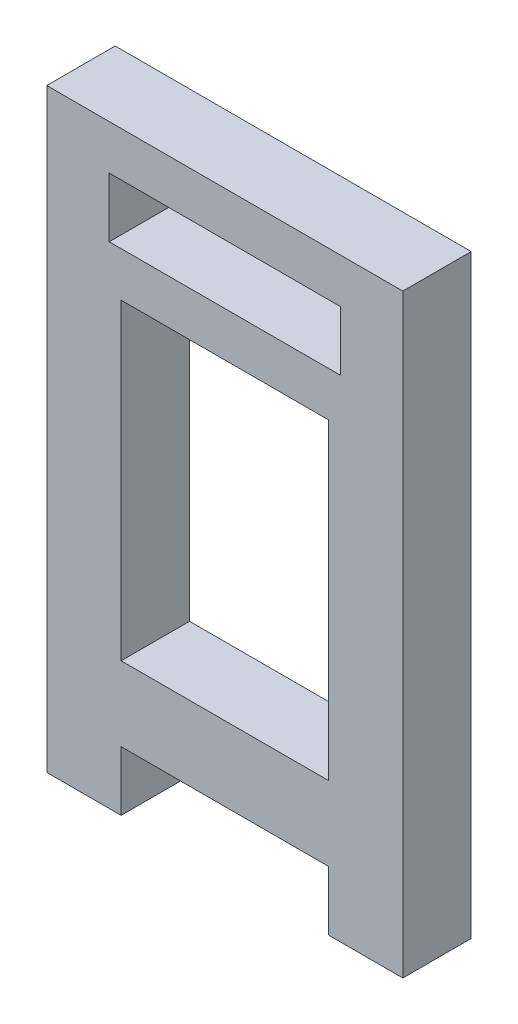
ISO-10303-21;
HEADER;
FILE_DESCRIPTION(('STEP AP214'),'2;1');
FILE_NAME('part.step','',(''),(''),'','','');
FILE_SCHEMA(('AUTOMOTIVE_DESIGN { 1 0 10303 214 1 1 1 1 }'));
ENDSEC;
DATA;
#1=APPLICATION_CONTEXT('core data for automotive mechanical design processes');
#2=APPLICATION_PROTOCOL_DEFINITION('international standard','automotive_design',2000,#1);
#3=PRODUCT_CONTEXT('',#1,'mechanical');
#4=PRODUCT('Part','Part','',(#3));
#5=PRODUCT_RELATED_PRODUCT_CATEGORY('part','',(#4));
#6=PRODUCT_DEFINITION_FORMATION('','',#4);
#7=PRODUCT_DEFINITION_CONTEXT('part definition',#1,'design');
#8=PRODUCT_DEFINITION('design','',#6,#7);
#9=PRODUCT_DEFINITION_SHAPE('','',#8);
#10=(LENGTH_UNIT() NAMED_UNIT(*) SI_UNIT(.MILLI.,.METRE.));
#11=(NAMED_UNIT(*) PLANE_ANGLE_UNIT() SI_UNIT($,.RADIAN.));
#12=(NAMED_UNIT(*) SI_UNIT($,.STERADIAN.) SOLID_ANGLE_UNIT());
#13=UNCERTAINTY_MEASURE_WITH_UNIT(LENGTH_MEASURE(1.E-05),#10,'distance_accuracy_value','');
#14=(GEOMETRIC_REPRESENTATION_CONTEXT(3) GLOBAL_UNCERTAINTY_ASSIGNED_CONTEXT((#13)) GLOBAL_UNIT_ASSIGNED_CONTEXT((#10,
#11,#12)) REPRESENTATION_CONTEXT('',''));
#15=CARTESIAN_POINT('',(0.,0.,0.));
#16=DIRECTION('',(0.,0.,1.));
#17=DIRECTION('',(1.,0.,0.));
#18=AXIS2_PLACEMENT_3D('',#15,#16,#17);
#19=CARTESIAN_POINT('',(0.,0.,2.3));
#20=DIRECTION('',(0.,0.,-1.));
#21=DIRECTION('',(-1.,0.,0.));
#22=AXIS2_PLACEMENT_3D('',#19,#20,#21);
#23=PLANE('',#22);
#24=DIRECTION('',(0.,1.,0.));
#25=VECTOR('',#24,1.);
#26=CARTESIAN_POINT('',(9.47,2.5,2.3));
#27=LINE('',#26,#25);
#28=CARTESIAN_POINT('',(9.47,2.5,2.3));
#29=VERTEX_POINT('',#28);
#30=CARTESIAN_POINT('',(9.47,13.,2.3));
#31=VERTEX_POINT('',#30);
#32=EDGE_CURVE('E188',#29,#31,#27,.T.);
#33=ORIENTED_EDGE('',*,*,#32,.F.);
#34=DIRECTION('',(1.,0.,0.));
#35=VECTOR('',#34,1.);
#36=CARTESIAN_POINT('',(2.5,2.5,2.3));
#37=LINE('',#36,#35);
#38=CARTESIAN_POINT('',(2.5,2.5,2.3));
#39=VERTEX_POINT('',#38);
#40=EDGE_CURVE('E196',#39,#29,#37,.T.);
#41=ORIENTED_EDGE('',*,*,#40,.F.);
#42=DIRECTION('',(0.,-1.,0.));
#43=VECTOR('',#42,1.);
#44=CARTESIAN_POINT('',(2.5,2.5,2.3));
#45=LINE('',#44,#43);
#46=CARTESIAN_POINT('',(2.5,13.,2.3));
#47=VERTEX_POINT('',#46);
#48=EDGE_CURVE('E193',#47,#39,#45,.T.);
#49=ORIENTED_EDGE('',*,*,#48,.F.);
#50=DIRECTION('',(-1.,0.,0.));
#51=VECTOR('',#50,1.);
#52=CARTESIAN_POINT('',(2.5,13.,2.3));
#53=LINE('',#52,#51);
#54=EDGE_CURVE('E190',#31,#47,#53,.T.);
#55=ORIENTED_EDGE('',*,*,#54,.F.);
#56=EDGE_LOOP('',(#33,#41,#49,#55));
#57=FACE_BOUND('',#56,.T.);
#58=DIRECTION('',(0.,-1.,0.));
#59=VECTOR('',#58,1.);
#60=CARTESIAN_POINT('',(0.,0.,2.3));
#61=LINE('',#60,#59);
#62=CARTESIAN_POINT('',(0.,18.,2.3));
#63=VERTEX_POINT('',#62);
#64=CARTESIAN_POINT('',(0.,-2.,2.3));
#65=VERTEX_POINT('',#64);
#66=EDGE_CURVE('E219',#63,#65,#61,.T.);
#67=ORIENTED_EDGE('',*,*,#66,.T.);
#68=DIRECTION('',(1.,0.,0.));
#69=VECTOR('',#68,1.);
#70=CARTESIAN_POINT('',(0.,-2.,2.3));
#71=LINE('',#70,#69);
#72=CARTESIAN_POINT('',(2.5,-2.,2.3));
#73=VERTEX_POINT('',#72);
#74=EDGE_CURVE('E221',#65,#73,#71,.T.);
#75=ORIENTED_EDGE('',*,*,#74,.T.);
#76=DIRECTION('',(0.,1.,0.));
#77=VECTOR('',#76,1.);
#78=CARTESIAN_POINT('',(2.5,-2.,2.3));
#79=LINE('',#78,#77);
#80=CARTESIAN_POINT('',(2.5,0.,2.3));
#81=VERTEX_POINT('',#80);
#82=EDGE_CURVE('E224',#73,#81,#79,.T.);
#83=ORIENTED_EDGE('',*,*,#82,.T.);
#84=DIRECTION('',(1.,0.,0.));
#85=VECTOR('',#84,1.);
#86=CARTESIAN_POINT('',(2.5,0.,2.3));
#87=LINE('',#86,#85);
#88=CARTESIAN_POINT('',(9.47,0.,2.3));
#89=VERTEX_POINT('',#88);
#90=EDGE_CURVE('E226',#81,#89,#87,.T.);
#91=ORIENTED_EDGE('',*,*,#90,.T.);
#92=DIRECTION('',(0.,-1.,0.));
#93=VECTOR('',#92,1.);
#94=CARTESIAN_POINT('',(9.47,-2.,2.3));
#95=LINE('',#94,#93);
#96=CARTESIAN_POINT('',(9.47,-2.,2.3));
#97=VERTEX_POINT('',#96);
#98=EDGE_CURVE('E228',#89,#97,#95,.T.);
#99=ORIENTED_EDGE('',*,*,#98,.T.);
#100=DIRECTION('',(1.,0.,0.));
#101=VECTOR('',#100,1.);
#102=CARTESIAN_POINT('',(11.97,-2.,2.3));
#103=LINE('',#102,#101);
#104=CARTESIAN_POINT('',(11.97,-2.,2.3));
#105=VERTEX_POINT('',#104);
#106=EDGE_CURVE('E230',#97,#105,#103,.T.);
#107=ORIENTED_EDGE('',*,*,#106,.T.);
#108=DIRECTION('',(0.,1.,0.));
#109=VECTOR('',#108,1.);
#110=CARTESIAN_POINT('',(11.97,0.,2.3));
#111=LINE('',#110,#109);
#112=CARTESIAN_POINT('',(11.97,18.,2.3));
#113=VERTEX_POINT('',#112);
#114=EDGE_CURVE('E232',#105,#113,#111,.T.);
#115=ORIENTED_EDGE('',*,*,#114,.T.);
#116=DIRECTION('',(-1.,0.,0.));
#117=VECTOR('',#116,1.);
#118=CARTESIAN_POINT('',(0.,18.,2.3));
#119=LINE('',#118,#117);
#120=EDGE_CURVE('E234',#113,#63,#119,.T.);
#121=ORIENTED_EDGE('',*,*,#120,.T.);
#122=EDGE_LOOP('',(#67,#75,#83,#91,#99,#107,#115,#121));
#123=FACE_BOUND('',#122,.T.);
#124=DIRECTION('',(0.,-1.,0.));
#125=VECTOR('',#124,1.);
#126=CARTESIAN_POINT('',(2.1,14.5,2.3));
#127=LINE('',#126,#125);
#128=CARTESIAN_POINT('',(2.1,16.5,2.3));
#129=VERTEX_POINT('',#128);
#130=CARTESIAN_POINT('',(2.1,14.5,2.3));
#131=VERTEX_POINT('',#130);
#132=EDGE_CURVE('E152',#129,#131,#127,.T.);
#133=ORIENTED_EDGE('',*,*,#132,.F.);
#134=DIRECTION('',(-1.,0.,0.));
#135=VECTOR('',#134,1.);
#136=CARTESIAN_POINT('',(2.1,16.5,2.3));
#137=LINE('',#136,#135);
#138=CARTESIAN_POINT('',(9.87,16.5,2.3));
#139=VERTEX_POINT('',#138);
#140=EDGE_CURVE('E174',#139,#129,#137,.T.);
#141=ORIENTED_EDGE('',*,*,#140,.F.);
#142=DIRECTION('',(0.,1.,0.));
#143=VECTOR('',#142,1.);
#144=CARTESIAN_POINT('',(9.87,14.5,2.3));
#145=LINE('',#144,#143);
#146=CARTESIAN_POINT('',(9.87,14.5,2.3));
#147=VERTEX_POINT('',#146);
#148=EDGE_CURVE('E172',#147,#139,#145,.T.);
#149=ORIENTED_EDGE('',*,*,#148,.F.);
#150=DIRECTION('',(1.,0.,0.));
#151=VECTOR('',#150,1.);
#152=CARTESIAN_POINT('',(2.1,14.5,2.3));
#153=LINE('',#152,#151);
#154=EDGE_CURVE('E160',#131,#147,#153,.T.);
#155=ORIENTED_EDGE('',*,*,#154,.F.);
#156=EDGE_LOOP('',(#133,#141,#149,#155));
#157=FACE_BOUND('',#156,.T.);
#158=ADVANCED_FACE('F39',(#57,#123,#157),#23,.F.);
#159=CARTESIAN_POINT('',(0.,0.,0.));
#160=DIRECTION('',(0.,0.,-1.));
#161=DIRECTION('',(-1.,0.,0.));
#162=AXIS2_PLACEMENT_3D('',#159,#160,#161);
#163=PLANE('',#162);
#164=DIRECTION('',(0.,-1.,0.));
#165=VECTOR('',#164,1.);
#166=CARTESIAN_POINT('',(0.,0.,0.));
#167=LINE('',#166,#165);
#168=CARTESIAN_POINT('',(0.,18.,0.));
#169=VERTEX_POINT('',#168);
#170=CARTESIAN_POINT('',(0.,-2.,0.));
#171=VERTEX_POINT('',#170);
#172=EDGE_CURVE('E218',#169,#171,#167,.T.);
#173=ORIENTED_EDGE('',*,*,#172,.F.);
#174=DIRECTION('',(-1.,0.,0.));
#175=VECTOR('',#174,1.);
#176=CARTESIAN_POINT('',(0.,18.,0.));
#177=LINE('',#176,#175);
#178=CARTESIAN_POINT('',(11.97,18.,0.));
#179=VERTEX_POINT('',#178);
#180=EDGE_CURVE('E222',#179,#169,#177,.T.);
#181=ORIENTED_EDGE('',*,*,#180,.F.);
#182=DIRECTION('',(0.,1.,0.));
#183=VECTOR('',#182,1.);
#184=CARTESIAN_POINT('',(11.97,0.,0.));
#185=LINE('',#184,#183);
#186=CARTESIAN_POINT('',(11.97,-2.,0.));
#187=VERTEX_POINT('',#186);
#188=EDGE_CURVE('E249',#187,#179,#185,.T.);
#189=ORIENTED_EDGE('',*,*,#188,.F.);
#190=DIRECTION('',(1.,0.,0.));
#191=VECTOR('',#190,1.);
#192=CARTESIAN_POINT('',(11.97,-2.,0.));
#193=LINE('',#192,#191);
#194=CARTESIAN_POINT('',(9.47,-2.,0.));
#195=VERTEX_POINT('',#194);
#196=EDGE_CURVE('E246',#195,#187,#193,.T.);
#197=ORIENTED_EDGE('',*,*,#196,.F.);
#198=DIRECTION('',(0.,-1.,0.));
#199=VECTOR('',#198,1.);
#200=CARTESIAN_POINT('',(9.47,-2.,0.));
#201=LINE('',#200,#199);
#202=CARTESIAN_POINT('',(9.47,0.,0.));
#203=VERTEX_POINT('',#202);
#204=EDGE_CURVE('E244',#203,#195,#201,.T.);
#205=ORIENTED_EDGE('',*,*,#204,.F.);
#206=DIRECTION('',(1.,0.,0.));
#207=VECTOR('',#206,1.);
#208=CARTESIAN_POINT('',(2.5,0.,0.));
#209=LINE('',#208,#207);
#210=CARTESIAN_POINT('',(2.5,0.,0.));
#211=VERTEX_POINT('',#210);
#212=EDGE_CURVE('E242',#211,#203,#209,.T.);
#213=ORIENTED_EDGE('',*,*,#212,.F.);
#214=DIRECTION('',(0.,1.,0.));
#215=VECTOR('',#214,1.);
#216=CARTESIAN_POINT('',(2.5,-2.,0.));
#217=LINE('',#216,#215);
#218=CARTESIAN_POINT('',(2.5,-2.,0.));
#219=VERTEX_POINT('',#218);
#220=EDGE_CURVE('E240',#219,#211,#217,.T.);
#221=ORIENTED_EDGE('',*,*,#220,.F.);
#222=DIRECTION('',(1.,0.,0.));
#223=VECTOR('',#222,1.);
#224=CARTESIAN_POINT('',(0.,-2.,0.));
#225=LINE('',#224,#223);
#226=EDGE_CURVE('E238',#171,#219,#225,.T.);
#227=ORIENTED_EDGE('',*,*,#226,.F.);
#228=EDGE_LOOP('',(#173,#181,#189,#197,#205,#213,#221,#227));
#229=FACE_BOUND('',#228,.T.);
#230=DIRECTION('',(1.,0.,0.));
#231=VECTOR('',#230,1.);
#232=CARTESIAN_POINT('',(2.5,2.5,0.));
#233=LINE('',#232,#231);
#234=CARTESIAN_POINT('',(2.5,2.5,0.));
#235=VERTEX_POINT('',#234);
#236=CARTESIAN_POINT('',(9.47,2.5,0.));
#237=VERTEX_POINT('',#236);
#238=EDGE_CURVE('E191',#235,#237,#233,.T.);
#239=ORIENTED_EDGE('',*,*,#238,.T.);
#240=DIRECTION('',(0.,1.,0.));
#241=VECTOR('',#240,1.);
#242=CARTESIAN_POINT('',(9.47,2.5,0.));
#243=LINE('',#242,#241);
#244=CARTESIAN_POINT('',(9.47,13.,0.));
#245=VERTEX_POINT('',#244);
#246=EDGE_CURVE('E168',#237,#245,#243,.T.);
#247=ORIENTED_EDGE('',*,*,#246,.T.);
#248=DIRECTION('',(-1.,0.,0.));
#249=VECTOR('',#248,1.);
#250=CARTESIAN_POINT('',(2.5,13.,0.));
#251=LINE('',#250,#249);
#252=CARTESIAN_POINT('',(2.5,13.,0.));
#253=VERTEX_POINT('',#252);
#254=EDGE_CURVE('E201',#245,#253,#251,.T.);
#255=ORIENTED_EDGE('',*,*,#254,.T.);
#256=DIRECTION('',(0.,-1.,0.));
#257=VECTOR('',#256,1.);
#258=CARTESIAN_POINT('',(2.5,2.5,0.));
#259=LINE('',#258,#257);
#260=EDGE_CURVE('E204',#253,#235,#259,.T.);
#261=ORIENTED_EDGE('',*,*,#260,.T.);
#262=EDGE_LOOP('',(#239,#247,#255,#261));
#263=FACE_BOUND('',#262,.T.);
#264=DIRECTION('',(-1.,0.,0.));
#265=VECTOR('',#264,1.);
#266=CARTESIAN_POINT('',(2.1,16.5,0.));
#267=LINE('',#266,#265);
#268=CARTESIAN_POINT('',(9.87,16.5,0.));
#269=VERTEX_POINT('',#268);
#270=CARTESIAN_POINT('',(2.1,16.5,0.));
#271=VERTEX_POINT('',#270);
#272=EDGE_CURVE('E161',#269,#271,#267,.T.);
#273=ORIENTED_EDGE('',*,*,#272,.T.);
#274=DIRECTION('',(0.,-1.,0.));
#275=VECTOR('',#274,1.);
#276=CARTESIAN_POINT('',(2.1,14.5,0.));
#277=LINE('',#276,#275);
#278=CARTESIAN_POINT('',(2.1,14.5,0.));
#279=VERTEX_POINT('',#278);
#280=EDGE_CURVE('E62',#271,#279,#277,.T.);
#281=ORIENTED_EDGE('',*,*,#280,.T.);
#282=DIRECTION('',(1.,0.,0.));
#283=VECTOR('',#282,1.);
#284=CARTESIAN_POINT('',(2.1,14.5,0.));
#285=LINE('',#284,#283);
#286=CARTESIAN_POINT('',(9.87,14.5,0.));
#287=VERTEX_POINT('',#286);
#288=EDGE_CURVE('E167',#279,#287,#285,.T.);
#289=ORIENTED_EDGE('',*,*,#288,.T.);
#290=DIRECTION('',(0.,1.,0.));
#291=VECTOR('',#290,1.);
#292=CARTESIAN_POINT('',(9.87,14.5,0.));
#293=LINE('',#292,#291);
#294=EDGE_CURVE('E180',#287,#269,#293,.T.);
#295=ORIENTED_EDGE('',*,*,#294,.T.);
#296=EDGE_LOOP('',(#273,#281,#289,#295));
#297=FACE_BOUND('',#296,.T.);
#298=ADVANCED_FACE('F281',(#229,#263,#297),#163,.T.);
#299=CARTESIAN_POINT('',(0.,0.,2.3));
#300=DIRECTION('',(1.,0.,0.));
#301=DIRECTION('',(0.,1.,0.));
#302=AXIS2_PLACEMENT_3D('',#299,#300,#301);
#303=PLANE('',#302);
#304=ORIENTED_EDGE('',*,*,#172,.T.);
#305=DIRECTION('',(0.,0.,-1.));
#306=VECTOR('',#305,1.);
#307=CARTESIAN_POINT('',(0.,-2.,2.3));
#308=LINE('',#307,#306);
#309=EDGE_CURVE('E11',#65,#171,#308,.T.);
#310=ORIENTED_EDGE('',*,*,#309,.F.);
#311=ORIENTED_EDGE('',*,*,#66,.F.);
#312=DIRECTION('',(0.,0.,-1.));
#313=VECTOR('',#312,1.);
#314=CARTESIAN_POINT('',(0.,18.,2.3));
#315=LINE('',#314,#313);
#316=EDGE_CURVE('E236',#63,#169,#315,.T.);
#317=ORIENTED_EDGE('',*,*,#316,.T.);
#318=EDGE_LOOP('',(#304,#310,#311,#317));
#319=FACE_BOUND('',#318,.T.);
#320=ADVANCED_FACE('F41',(#319),#303,.F.);
#321=CARTESIAN_POINT('',(0.,-2.,2.3));
#322=DIRECTION('',(0.,1.,0.));
#323=DIRECTION('',(0.,0.,1.));
#324=AXIS2_PLACEMENT_3D('',#321,#322,#323);
#325=PLANE('',#324);
#326=ORIENTED_EDGE('',*,*,#226,.T.);
#327=DIRECTION('',(0.,0.,-1.));
#328=VECTOR('',#327,1.);
#329=CARTESIAN_POINT('',(2.5,-2.,2.3));
#330=LINE('',#329,#328);
#331=EDGE_CURVE('E47',#73,#219,#330,.T.);
#332=ORIENTED_EDGE('',*,*,#331,.F.);
#333=ORIENTED_EDGE('',*,*,#74,.F.);
#334=ORIENTED_EDGE('',*,*,#309,.T.);
#335=EDGE_LOOP('',(#326,#332,#333,#334));
#336=FACE_BOUND('',#335,.T.);
#337=ADVANCED_FACE('F298',(#336),#325,.F.);
#338=CARTESIAN_POINT('',(2.5,-2.,2.3));
#339=DIRECTION('',(-1.,0.,0.));
#340=DIRECTION('',(0.,0.,1.));
#341=AXIS2_PLACEMENT_3D('',#338,#339,#340);
#342=PLANE('',#341);
#343=ORIENTED_EDGE('',*,*,#220,.T.);
#344=DIRECTION('',(0.,0.,-1.));
#345=VECTOR('',#344,1.);
#346=CARTESIAN_POINT('',(2.5,0.,2.3));
#347=LINE('',#346,#345);
#348=EDGE_CURVE('E267',#81,#211,#347,.T.);
#349=ORIENTED_EDGE('',*,*,#348,.F.);
#350=ORIENTED_EDGE('',*,*,#82,.F.);
#351=ORIENTED_EDGE('',*,*,#331,.T.);
#352=EDGE_LOOP('',(#343,#349,#350,#351));
#353=FACE_BOUND('',#352,.T.);
#354=ADVANCED_FACE('F274',(#353),#342,.F.);
#355=CARTESIAN_POINT('',(2.5,0.,2.3));
#356=DIRECTION('',(0.,1.,0.));
#357=DIRECTION('',(0.,0.,1.));
#358=AXIS2_PLACEMENT_3D('',#355,#356,#357);
#359=PLANE('',#358);
#360=ORIENTED_EDGE('',*,*,#212,.T.);
#361=DIRECTION('',(0.,0.,-1.));
#362=VECTOR('',#361,1.);
#363=CARTESIAN_POINT('',(9.47,0.,2.3));
#364=LINE('',#363,#362);
#365=EDGE_CURVE('E264',#89,#203,#364,.T.);
#366=ORIENTED_EDGE('',*,*,#365,.F.);
#367=ORIENTED_EDGE('',*,*,#90,.F.);
#368=ORIENTED_EDGE('',*,*,#348,.T.);
#369=EDGE_LOOP('',(#360,#366,#367,#368));
#370=FACE_BOUND('',#369,.T.);
#371=ADVANCED_FACE('F287',(#370),#359,.F.);
#372=CARTESIAN_POINT('',(9.47,-2.,2.3));
#373=DIRECTION('',(1.,0.,0.));
#374=DIRECTION('',(0.,0.,-1.));
#375=AXIS2_PLACEMENT_3D('',#372,#373,#374);
#376=PLANE('',#375);
#377=ORIENTED_EDGE('',*,*,#204,.T.);
#378=DIRECTION('',(0.,0.,-1.));
#379=VECTOR('',#378,1.);
#380=CARTESIAN_POINT('',(9.47,-2.,2.3));
#381=LINE('',#380,#379);
#382=EDGE_CURVE('E261',#97,#195,#381,.T.);
#383=ORIENTED_EDGE('',*,*,#382,.F.);
#384=ORIENTED_EDGE('',*,*,#98,.F.);
#385=ORIENTED_EDGE('',*,*,#365,.T.);
#386=EDGE_LOOP('',(#377,#383,#384,#385));
#387=FACE_BOUND('',#386,.T.);
#388=ADVANCED_FACE('F291',(#387),#376,.F.);
#389=CARTESIAN_POINT('',(11.97,-2.,2.3));
#390=DIRECTION('',(0.,1.,0.));
#391=DIRECTION('',(-1.,0.,0.));
#392=AXIS2_PLACEMENT_3D('',#389,#390,#391);
#393=PLANE('',#392);
#394=ORIENTED_EDGE('',*,*,#196,.T.);
#395=DIRECTION('',(0.,0.,-1.));
#396=VECTOR('',#395,1.);
#397=CARTESIAN_POINT('',(11.97,-2.,2.3));
#398=LINE('',#397,#396);
#399=EDGE_CURVE('E258',#105,#187,#398,.T.);
#400=ORIENTED_EDGE('',*,*,#399,.F.);
#401=ORIENTED_EDGE('',*,*,#106,.F.);
#402=ORIENTED_EDGE('',*,*,#382,.T.);
#403=EDGE_LOOP('',(#394,#400,#401,#402));
#404=FACE_BOUND('',#403,.T.);
#405=ADVANCED_FACE('F310',(#404),#393,.F.);
#406=CARTESIAN_POINT('',(11.97,0.,2.3));
#407=DIRECTION('',(-1.,0.,0.));
#408=DIRECTION('',(0.,0.,1.));
#409=AXIS2_PLACEMENT_3D('',#406,#407,#408);
#410=PLANE('',#409);
#411=ORIENTED_EDGE('',*,*,#188,.T.);
#412=DIRECTION('',(0.,0.,-1.));
#413=VECTOR('',#412,1.);
#414=CARTESIAN_POINT('',(11.97,18.,2.3));
#415=LINE('',#414,#413);
#416=EDGE_CURVE('E255',#113,#179,#415,.T.);
#417=ORIENTED_EDGE('',*,*,#416,.F.);
#418=ORIENTED_EDGE('',*,*,#114,.F.);
#419=ORIENTED_EDGE('',*,*,#399,.T.);
#420=EDGE_LOOP('',(#411,#417,#418,#419));
#421=FACE_BOUND('',#420,.T.);
#422=ADVANCED_FACE('F308',(#421),#410,.F.);
#423=CARTESIAN_POINT('',(0.,18.,2.3));
#424=DIRECTION('',(0.,-1.,0.));
#425=DIRECTION('',(0.,0.,-1.));
#426=AXIS2_PLACEMENT_3D('',#423,#424,#425);
#427=PLANE('',#426);
#428=ORIENTED_EDGE('',*,*,#180,.T.);
#429=ORIENTED_EDGE('',*,*,#316,.F.);
#430=ORIENTED_EDGE('',*,*,#120,.F.);
#431=ORIENTED_EDGE('',*,*,#416,.T.);
#432=EDGE_LOOP('',(#428,#429,#430,#431));
#433=FACE_BOUND('',#432,.T.);
#434=ADVANCED_FACE('F303',(#433),#427,.F.);
#435=CARTESIAN_POINT('',(9.47,2.5,2.3));
#436=DIRECTION('',(-1.,0.,0.));
#437=DIRECTION('',(0.,0.,1.));
#438=AXIS2_PLACEMENT_3D('',#435,#436,#437);
#439=PLANE('',#438);
#440=ORIENTED_EDGE('',*,*,#246,.F.);
#441=DIRECTION('',(0.,0.,-1.));
#442=VECTOR('',#441,1.);
#443=CARTESIAN_POINT('',(9.47,2.5,2.3));
#444=LINE('',#443,#442);
#445=EDGE_CURVE('E198',#29,#237,#444,.T.);
#446=ORIENTED_EDGE('',*,*,#445,.F.);
#447=ORIENTED_EDGE('',*,*,#32,.T.);
#448=DIRECTION('',(0.,0.,-1.));
#449=VECTOR('',#448,1.);
#450=CARTESIAN_POINT('',(9.47,13.,2.3));
#451=LINE('',#450,#449);
#452=EDGE_CURVE('E215',#31,#245,#451,.T.);
#453=ORIENTED_EDGE('',*,*,#452,.T.);
#454=EDGE_LOOP('',(#440,#446,#447,#453));
#455=FACE_BOUND('',#454,.T.);
#456=ADVANCED_FACE('F328',(#455),#439,.T.);
#457=CARTESIAN_POINT('',(2.5,13.,2.3));
#458=DIRECTION('',(0.,-1.,0.));
#459=DIRECTION('',(0.,0.,-1.));
#460=AXIS2_PLACEMENT_3D('',#457,#458,#459);
#461=PLANE('',#460);
#462=ORIENTED_EDGE('',*,*,#254,.F.);
#463=ORIENTED_EDGE('',*,*,#452,.F.);
#464=ORIENTED_EDGE('',*,*,#54,.T.);
#465=DIRECTION('',(0.,0.,-1.));
#466=VECTOR('',#465,1.);
#467=CARTESIAN_POINT('',(2.5,13.,2.3));
#468=LINE('',#467,#466);
#469=EDGE_CURVE('E213',#47,#253,#468,.T.);
#470=ORIENTED_EDGE('',*,*,#469,.T.);
#471=EDGE_LOOP('',(#462,#463,#464,#470));
#472=FACE_BOUND('',#471,.T.);
#473=ADVANCED_FACE('F335',(#472),#461,.T.);
#474=CARTESIAN_POINT('',(2.5,2.5,2.3));
#475=DIRECTION('',(1.,0.,0.));
#476=DIRECTION('',(0.,0.,-1.));
#477=AXIS2_PLACEMENT_3D('',#474,#475,#476);
#478=PLANE('',#477);
#479=ORIENTED_EDGE('',*,*,#260,.F.);
#480=ORIENTED_EDGE('',*,*,#469,.F.);
#481=ORIENTED_EDGE('',*,*,#48,.T.);
#482=DIRECTION('',(0.,0.,-1.));
#483=VECTOR('',#482,1.);
#484=CARTESIAN_POINT('',(2.5,2.5,2.3));
#485=LINE('',#484,#483);
#486=EDGE_CURVE('E211',#39,#235,#485,.T.);
#487=ORIENTED_EDGE('',*,*,#486,.T.);
#488=EDGE_LOOP('',(#479,#480,#481,#487));
#489=FACE_BOUND('',#488,.T.);
#490=ADVANCED_FACE('F340',(#489),#478,.T.);
#491=CARTESIAN_POINT('',(2.5,2.5,2.3));
#492=DIRECTION('',(0.,1.,0.));
#493=DIRECTION('',(0.,0.,1.));
#494=AXIS2_PLACEMENT_3D('',#491,#492,#493);
#495=PLANE('',#494);
#496=ORIENTED_EDGE('',*,*,#238,.F.);
#497=ORIENTED_EDGE('',*,*,#486,.F.);
#498=ORIENTED_EDGE('',*,*,#40,.T.);
#499=ORIENTED_EDGE('',*,*,#445,.T.);
#500=EDGE_LOOP('',(#496,#497,#498,#499));
#501=FACE_BOUND('',#500,.T.);
#502=ADVANCED_FACE('F346',(#501),#495,.T.);
#503=CARTESIAN_POINT('',(2.1,14.5,2.3));
#504=DIRECTION('',(1.,0.,0.));
#505=DIRECTION('',(0.,0.,-1.));
#506=AXIS2_PLACEMENT_3D('',#503,#504,#505);
#507=PLANE('',#506);
#508=ORIENTED_EDGE('',*,*,#280,.F.);
#509=DIRECTION('',(0.,0.,-1.));
#510=VECTOR('',#509,1.);
#511=CARTESIAN_POINT('',(2.1,16.5,2.3));
#512=LINE('',#511,#510);
#513=EDGE_CURVE('E156',#129,#271,#512,.T.);
#514=ORIENTED_EDGE('',*,*,#513,.F.);
#515=ORIENTED_EDGE('',*,*,#132,.T.);
#516=DIRECTION('',(0.,0.,-1.));
#517=VECTOR('',#516,1.);
#518=CARTESIAN_POINT('',(2.1,14.5,2.3));
#519=LINE('',#518,#517);
#520=EDGE_CURVE('E155',#131,#279,#519,.T.);
#521=ORIENTED_EDGE('',*,*,#520,.T.);
#522=EDGE_LOOP('',(#508,#514,#515,#521));
#523=FACE_BOUND('',#522,.T.);
#524=ADVANCED_FACE('F154',(#523),#507,.T.);
#525=CARTESIAN_POINT('',(2.1,14.5,2.3));
#526=DIRECTION('',(0.,1.,0.));
#527=DIRECTION('',(0.,0.,1.));
#528=AXIS2_PLACEMENT_3D('',#525,#526,#527);
#529=PLANE('',#528);
#530=ORIENTED_EDGE('',*,*,#288,.F.);
#531=ORIENTED_EDGE('',*,*,#520,.F.);
#532=ORIENTED_EDGE('',*,*,#154,.T.);
#533=DIRECTION('',(0.,0.,-1.));
#534=VECTOR('',#533,1.);
#535=CARTESIAN_POINT('',(9.87,14.5,2.3));
#536=LINE('',#535,#534);
#537=EDGE_CURVE('E169',#147,#287,#536,.T.);
#538=ORIENTED_EDGE('',*,*,#537,.T.);
#539=EDGE_LOOP('',(#530,#531,#532,#538));
#540=FACE_BOUND('',#539,.T.);
#541=ADVANCED_FACE('F164',(#540),#529,.T.);
#542=CARTESIAN_POINT('',(9.87,14.5,2.3));
#543=DIRECTION('',(-1.,0.,0.));
#544=DIRECTION('',(0.,0.,1.));
#545=AXIS2_PLACEMENT_3D('',#542,#543,#544);
#546=PLANE('',#545);
#547=ORIENTED_EDGE('',*,*,#294,.F.);
#548=ORIENTED_EDGE('',*,*,#537,.F.);
#549=ORIENTED_EDGE('',*,*,#148,.T.);
#550=DIRECTION('',(0.,0.,-1.));
#551=VECTOR('',#550,1.);
#552=CARTESIAN_POINT('',(9.87,16.5,2.3));
#553=LINE('',#552,#551);
#554=EDGE_CURVE('E54',#139,#269,#553,.T.);
#555=ORIENTED_EDGE('',*,*,#554,.T.);
#556=EDGE_LOOP('',(#547,#548,#549,#555));
#557=FACE_BOUND('',#556,.T.);
#558=ADVANCED_FACE('F365',(#557),#546,.T.);
#559=CARTESIAN_POINT('',(2.1,16.5,2.3));
#560=DIRECTION('',(0.,-1.,0.));
#561=DIRECTION('',(0.,0.,-1.));
#562=AXIS2_PLACEMENT_3D('',#559,#560,#561);
#563=PLANE('',#562);
#564=ORIENTED_EDGE('',*,*,#272,.F.);
#565=ORIENTED_EDGE('',*,*,#554,.F.);
#566=ORIENTED_EDGE('',*,*,#140,.T.);
#567=ORIENTED_EDGE('',*,*,#513,.T.);
#568=EDGE_LOOP('',(#564,#565,#566,#567));
#569=FACE_BOUND('',#568,.T.);
#570=ADVANCED_FACE('F368',(#569),#563,.T.);
#571=CLOSED_SHELL('',(#158,#298,#320,#337,#354,#371,#388,#405,#422,#434,#456,#473,#490,#502,
#524,#541,#558,#570));
#572=MANIFOLD_SOLID_BREP('B2',#571);
#573=ADVANCED_BREP_SHAPE_REPRESENTATION('',(#18,#572),#14);
#574=SHAPE_DEFINITION_REPRESENTATION(#9,#573);
ENDSEC;
END-ISO-10303-21;
